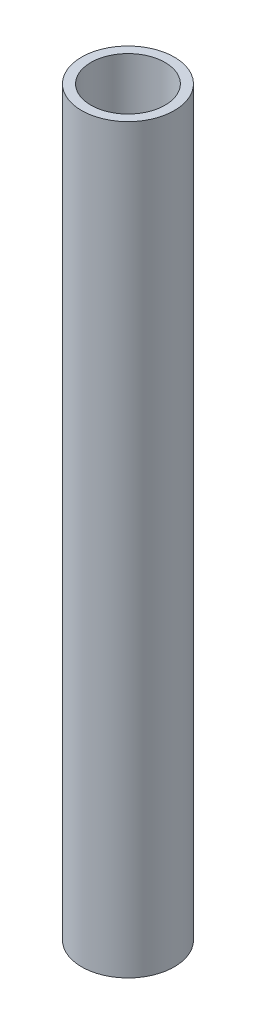
ISO-10303-21;
HEADER;
FILE_DESCRIPTION(('STEP AP214'),'2;1');
FILE_NAME('part.step','',(''),(''),'','','');
FILE_SCHEMA(('AUTOMOTIVE_DESIGN { 1 0 10303 214 1 1 1 1 }'));
ENDSEC;
DATA;
#1=APPLICATION_CONTEXT('core data for automotive mechanical design processes');
#2=APPLICATION_PROTOCOL_DEFINITION('international standard','automotive_design',2000,#1);
#3=PRODUCT_CONTEXT('',#1,'mechanical');
#4=PRODUCT('Part','Part','',(#3));
#5=PRODUCT_RELATED_PRODUCT_CATEGORY('part','',(#4));
#6=PRODUCT_DEFINITION_FORMATION('','',#4);
#7=PRODUCT_DEFINITION_CONTEXT('part definition',#1,'design');
#8=PRODUCT_DEFINITION('design','',#6,#7);
#9=PRODUCT_DEFINITION_SHAPE('','',#8);
#10=(LENGTH_UNIT() NAMED_UNIT(*) SI_UNIT(.MILLI.,.METRE.));
#11=(NAMED_UNIT(*) PLANE_ANGLE_UNIT() SI_UNIT($,.RADIAN.));
#12=(NAMED_UNIT(*) SI_UNIT($,.STERADIAN.) SOLID_ANGLE_UNIT());
#13=UNCERTAINTY_MEASURE_WITH_UNIT(LENGTH_MEASURE(1.E-05),#10,'distance_accuracy_value','');
#14=(GEOMETRIC_REPRESENTATION_CONTEXT(3) GLOBAL_UNCERTAINTY_ASSIGNED_CONTEXT((#13)) GLOBAL_UNIT_ASSIGNED_CONTEXT((#10,
#11,#12)) REPRESENTATION_CONTEXT('',''));
#15=CARTESIAN_POINT('',(0.,0.,0.));
#16=DIRECTION('',(0.,0.,1.));
#17=DIRECTION('',(1.,0.,0.));
#18=AXIS2_PLACEMENT_3D('',#15,#16,#17);
#19=CARTESIAN_POINT('',(0.,0.,0.));
#20=DIRECTION('',(0.,1.,0.));
#21=DIRECTION('',(-1.,0.,0.));
#22=AXIS2_PLACEMENT_3D('',#19,#20,#21);
#23=PLANE('',#22);
#24=CARTESIAN_POINT('',(0.,0.,0.));
#25=DIRECTION('',(0.,1.,0.));
#26=DIRECTION('',(-1.,0.,0.));
#27=AXIS2_PLACEMENT_3D('',#24,#25,#26);
#28=CIRCLE('',#27,12.5);
#29=CARTESIAN_POINT('',(-12.5,0.,0.));
#30=VERTEX_POINT('',#29);
#31=EDGE_CURVE('E10',#30,#30,#28,.T.);
#32=ORIENTED_EDGE('',*,*,#31,.F.);
#33=EDGE_LOOP('',(#32));
#34=FACE_BOUND('',#33,.T.);
#35=ADVANCED_FACE('F37',(#34),#23,.F.);
#36=CARTESIAN_POINT('',(0.,200.,0.));
#37=DIRECTION('',(0.,1.,0.));
#38=DIRECTION('',(-1.,0.,0.));
#39=AXIS2_PLACEMENT_3D('',#36,#37,#38);
#40=CYLINDRICAL_SURFACE('',#39,12.5);
#41=CARTESIAN_POINT('',(0.,200.,0.));
#42=DIRECTION('',(0.,1.,0.));
#43=DIRECTION('',(-1.,0.,0.));
#44=AXIS2_PLACEMENT_3D('',#41,#42,#43);
#45=CIRCLE('',#44,12.5);
#46=CARTESIAN_POINT('',(-12.5,200.,0.));
#47=VERTEX_POINT('',#46);
#48=EDGE_CURVE('E43',#47,#47,#45,.T.);
#49=ORIENTED_EDGE('',*,*,#48,.F.);
#50=EDGE_LOOP('',(#49));
#51=FACE_BOUND('',#50,.T.);
#52=ORIENTED_EDGE('',*,*,#31,.T.);
#53=EDGE_LOOP('',(#52));
#54=FACE_BOUND('',#53,.T.);
#55=ADVANCED_FACE('F61',(#51,#54),#40,.T.);
#56=CARTESIAN_POINT('',(0.,200.,0.));
#57=DIRECTION('',(0.,-1.,0.));
#58=DIRECTION('',(1.,0.,0.));
#59=AXIS2_PLACEMENT_3D('',#56,#57,#58);
#60=PLANE('',#59);
#61=CARTESIAN_POINT('',(0.,200.,0.));
#62=DIRECTION('',(0.,1.,0.));
#63=DIRECTION('',(-1.,0.,0.));
#64=AXIS2_PLACEMENT_3D('',#61,#62,#63);
#65=CIRCLE('',#64,10.);
#66=CARTESIAN_POINT('',(-10.,200.,0.));
#67=VERTEX_POINT('',#66);
#68=EDGE_CURVE('E51',#67,#67,#65,.T.);
#69=ORIENTED_EDGE('',*,*,#68,.F.);
#70=EDGE_LOOP('',(#69));
#71=FACE_BOUND('',#70,.T.);
#72=ORIENTED_EDGE('',*,*,#48,.T.);
#73=EDGE_LOOP('',(#72));
#74=FACE_BOUND('',#73,.T.);
#75=ADVANCED_FACE('F59',(#71,#74),#60,.F.);
#76=CARTESIAN_POINT('',(0.,128.5,0.));
#77=DIRECTION('',(0.,1.,0.));
#78=DIRECTION('',(-1.,0.,0.));
#79=AXIS2_PLACEMENT_3D('',#76,#77,#78);
#80=CYLINDRICAL_SURFACE('',#79,10.);
#81=CARTESIAN_POINT('',(0.,128.5,0.));
#82=DIRECTION('',(0.,1.,0.));
#83=DIRECTION('',(-1.,0.,0.));
#84=AXIS2_PLACEMENT_3D('',#81,#82,#83);
#85=CIRCLE('',#84,10.);
#86=CARTESIAN_POINT('',(-10.,128.5,0.));
#87=VERTEX_POINT('',#86);
#88=EDGE_CURVE('E47',#87,#87,#85,.T.);
#89=ORIENTED_EDGE('',*,*,#88,.F.);
#90=EDGE_LOOP('',(#89));
#91=FACE_BOUND('',#90,.T.);
#92=ORIENTED_EDGE('',*,*,#68,.T.);
#93=EDGE_LOOP('',(#92));
#94=FACE_BOUND('',#93,.T.);
#95=ADVANCED_FACE('F57',(#91,#94),#80,.F.);
#96=CARTESIAN_POINT('',(0.,128.5,0.));
#97=DIRECTION('',(0.,1.,0.));
#98=DIRECTION('',(-1.,0.,0.));
#99=AXIS2_PLACEMENT_3D('',#96,#97,#98);
#100=PLANE('',#99);
#101=ORIENTED_EDGE('',*,*,#88,.T.);
#102=EDGE_LOOP('',(#101));
#103=FACE_BOUND('',#102,.T.);
#104=ADVANCED_FACE('F67',(#103),#100,.T.);
#105=CLOSED_SHELL('',(#35,#55,#75,#95,#104));
#106=MANIFOLD_SOLID_BREP('B2',#105);
#107=ADVANCED_BREP_SHAPE_REPRESENTATION('',(#18,#106),#14);
#108=SHAPE_DEFINITION_REPRESENTATION(#9,#107);
ENDSEC;
END-ISO-10303-21;
